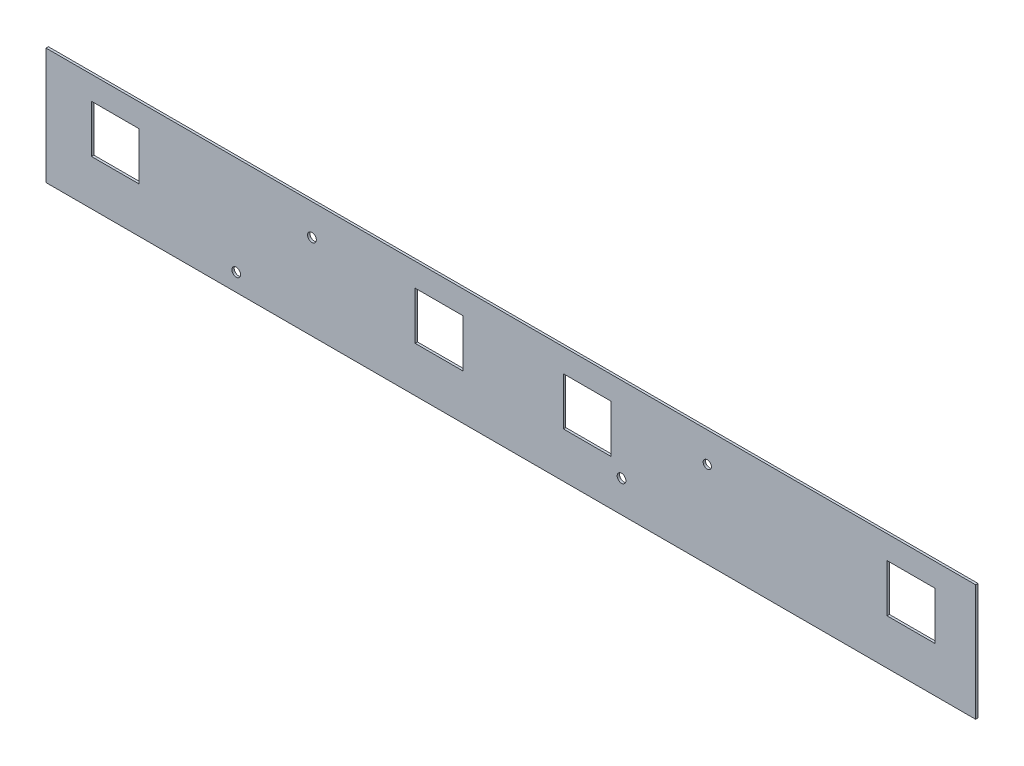
ISO-10303-21;
HEADER;
FILE_DESCRIPTION(('STEP AP214'),'2;1');
FILE_NAME('part.step','',(''),(''),'','','');
FILE_SCHEMA(('AUTOMOTIVE_DESIGN { 1 0 10303 214 1 1 1 1 }'));
ENDSEC;
DATA;
#1=APPLICATION_CONTEXT('core data for automotive mechanical design processes');
#2=APPLICATION_PROTOCOL_DEFINITION('international standard','automotive_design',2000,#1);
#3=PRODUCT_CONTEXT('',#1,'mechanical');
#4=PRODUCT('Part','Part','',(#3));
#5=PRODUCT_RELATED_PRODUCT_CATEGORY('part','',(#4));
#6=PRODUCT_DEFINITION_FORMATION('','',#4);
#7=PRODUCT_DEFINITION_CONTEXT('part definition',#1,'design');
#8=PRODUCT_DEFINITION('design','',#6,#7);
#9=PRODUCT_DEFINITION_SHAPE('','',#8);
#10=(LENGTH_UNIT() NAMED_UNIT(*) SI_UNIT(.MILLI.,.METRE.));
#11=(NAMED_UNIT(*) PLANE_ANGLE_UNIT() SI_UNIT($,.RADIAN.));
#12=(NAMED_UNIT(*) SI_UNIT($,.STERADIAN.) SOLID_ANGLE_UNIT());
#13=UNCERTAINTY_MEASURE_WITH_UNIT(LENGTH_MEASURE(1.E-05),#10,'distance_accuracy_value','');
#14=(GEOMETRIC_REPRESENTATION_CONTEXT(3) GLOBAL_UNCERTAINTY_ASSIGNED_CONTEXT((#13)) GLOBAL_UNIT_ASSIGNED_CONTEXT((#10,
#11,#12)) REPRESENTATION_CONTEXT('',''));
#15=CARTESIAN_POINT('',(0.,0.,0.));
#16=DIRECTION('',(0.,0.,1.));
#17=DIRECTION('',(1.,0.,0.));
#18=AXIS2_PLACEMENT_3D('',#15,#16,#17);
#19=CARTESIAN_POINT('',(-350.636981865229,-168.419363817683,-1.5875));
#20=DIRECTION('',(-1.,0.,0.));
#21=DIRECTION('',(0.,0.,1.));
#22=AXIS2_PLACEMENT_3D('',#19,#20,#21);
#23=PLANE('',#22);
#24=DIRECTION('',(0.,-1.,0.));
#25=VECTOR('',#24,1.);
#26=CARTESIAN_POINT('',(-350.636981865229,-168.419363817683,0.));
#27=LINE('',#26,#25);
#28=CARTESIAN_POINT('',(-350.636981865229,-90.2559438176829,0.));
#29=VERTEX_POINT('',#28);
#30=CARTESIAN_POINT('',(-350.636981865229,-168.419363817683,0.));
#31=VERTEX_POINT('',#30);
#32=EDGE_CURVE('E331',#29,#31,#27,.T.);
#33=ORIENTED_EDGE('',*,*,#32,.F.);
#34=DIRECTION('',(0.,0.,1.));
#35=VECTOR('',#34,1.);
#36=CARTESIAN_POINT('',(-350.636981865229,-90.2559438176829,-1.5875));
#37=LINE('',#36,#35);
#38=CARTESIAN_POINT('',(-350.636981865229,-90.2559438176829,-1.5875));
#39=VERTEX_POINT('',#38);
#40=EDGE_CURVE('E11',#39,#29,#37,.T.);
#41=ORIENTED_EDGE('',*,*,#40,.F.);
#42=DIRECTION('',(0.,-1.,0.));
#43=VECTOR('',#42,1.);
#44=CARTESIAN_POINT('',(-350.636981865229,-168.419363817683,-1.5875));
#45=LINE('',#44,#43);
#46=CARTESIAN_POINT('',(-350.636981865229,-168.419363817683,-1.5875));
#47=VERTEX_POINT('',#46);
#48=EDGE_CURVE('E334',#39,#47,#45,.T.);
#49=ORIENTED_EDGE('',*,*,#48,.T.);
#50=DIRECTION('',(0.,0.,1.));
#51=VECTOR('',#50,1.);
#52=CARTESIAN_POINT('',(-350.636981865229,-168.419363817683,-1.5875));
#53=LINE('',#52,#51);
#54=EDGE_CURVE('E41',#47,#31,#53,.T.);
#55=ORIENTED_EDGE('',*,*,#54,.T.);
#56=EDGE_LOOP('',(#33,#41,#49,#55));
#57=FACE_BOUND('',#56,.T.);
#58=ADVANCED_FACE('F38',(#57),#23,.T.);
#59=CARTESIAN_POINT('',(-350.636981865229,-90.2559438176829,-1.5875));
#60=DIRECTION('',(0.,1.,0.));
#61=DIRECTION('',(0.,0.,1.));
#62=AXIS2_PLACEMENT_3D('',#59,#60,#61);
#63=PLANE('',#62);
#64=DIRECTION('',(-1.,0.,0.));
#65=VECTOR('',#64,1.);
#66=CARTESIAN_POINT('',(-350.636981865229,-90.2559438176829,0.));
#67=LINE('',#66,#65);
#68=CARTESIAN_POINT('',(272.922858134777,-90.2559438176829,0.));
#69=VERTEX_POINT('',#68);
#70=EDGE_CURVE('E338',#69,#29,#67,.T.);
#71=ORIENTED_EDGE('',*,*,#70,.F.);
#72=DIRECTION('',(0.,0.,1.));
#73=VECTOR('',#72,1.);
#74=CARTESIAN_POINT('',(272.922858134777,-90.2559438176829,-1.5875));
#75=LINE('',#74,#73);
#76=CARTESIAN_POINT('',(272.922858134777,-90.2559438176829,-1.5875));
#77=VERTEX_POINT('',#76);
#78=EDGE_CURVE('E46',#77,#69,#75,.T.);
#79=ORIENTED_EDGE('',*,*,#78,.F.);
#80=DIRECTION('',(-1.,0.,0.));
#81=VECTOR('',#80,1.);
#82=CARTESIAN_POINT('',(-350.636981865229,-90.2559438176829,-1.5875));
#83=LINE('',#82,#81);
#84=EDGE_CURVE('E344',#77,#39,#83,.T.);
#85=ORIENTED_EDGE('',*,*,#84,.T.);
#86=ORIENTED_EDGE('',*,*,#40,.T.);
#87=EDGE_LOOP('',(#71,#79,#85,#86));
#88=FACE_BOUND('',#87,.T.);
#89=ADVANCED_FACE('F370',(#88),#63,.T.);
#90=CARTESIAN_POINT('',(272.922858134777,-168.419363817683,-1.5875));
#91=DIRECTION('',(1.,0.,0.));
#92=DIRECTION('',(0.,0.,-1.));
#93=AXIS2_PLACEMENT_3D('',#90,#91,#92);
#94=PLANE('',#93);
#95=DIRECTION('',(0.,1.,0.));
#96=VECTOR('',#95,1.);
#97=CARTESIAN_POINT('',(272.922858134777,-168.419363817683,0.));
#98=LINE('',#97,#96);
#99=CARTESIAN_POINT('',(272.922858134777,-168.419363817683,0.));
#100=VERTEX_POINT('',#99);
#101=EDGE_CURVE('E352',#100,#69,#98,.T.);
#102=ORIENTED_EDGE('',*,*,#101,.F.);
#103=DIRECTION('',(0.,0.,1.));
#104=VECTOR('',#103,1.);
#105=CARTESIAN_POINT('',(272.922858134777,-168.419363817683,-1.5875));
#106=LINE('',#105,#104);
#107=CARTESIAN_POINT('',(272.922858134777,-168.419363817683,-1.5875));
#108=VERTEX_POINT('',#107);
#109=EDGE_CURVE('E357',#108,#100,#106,.T.);
#110=ORIENTED_EDGE('',*,*,#109,.F.);
#111=DIRECTION('',(0.,1.,0.));
#112=VECTOR('',#111,1.);
#113=CARTESIAN_POINT('',(272.922858134777,-168.419363817683,-1.5875));
#114=LINE('',#113,#112);
#115=EDGE_CURVE('E341',#108,#77,#114,.T.);
#116=ORIENTED_EDGE('',*,*,#115,.T.);
#117=ORIENTED_EDGE('',*,*,#78,.T.);
#118=EDGE_LOOP('',(#102,#110,#116,#117));
#119=FACE_BOUND('',#118,.T.);
#120=ADVANCED_FACE('F375',(#119),#94,.T.);
#121=CARTESIAN_POINT('',(-350.636981865229,-168.419363817683,-1.5875));
#122=DIRECTION('',(0.,-1.,0.));
#123=DIRECTION('',(0.,0.,-1.));
#124=AXIS2_PLACEMENT_3D('',#121,#122,#123);
#125=PLANE('',#124);
#126=DIRECTION('',(1.,0.,0.));
#127=VECTOR('',#126,1.);
#128=CARTESIAN_POINT('',(-350.636981865229,-168.419363817683,0.));
#129=LINE('',#128,#127);
#130=EDGE_CURVE('E349',#31,#100,#129,.T.);
#131=ORIENTED_EDGE('',*,*,#130,.F.);
#132=ORIENTED_EDGE('',*,*,#54,.F.);
#133=DIRECTION('',(1.,0.,0.));
#134=VECTOR('',#133,1.);
#135=CARTESIAN_POINT('',(-350.636981865229,-168.419363817683,-1.5875));
#136=LINE('',#135,#134);
#137=EDGE_CURVE('E337',#47,#108,#136,.T.);
#138=ORIENTED_EDGE('',*,*,#137,.T.);
#139=ORIENTED_EDGE('',*,*,#109,.T.);
#140=EDGE_LOOP('',(#131,#132,#138,#139));
#141=FACE_BOUND('',#140,.T.);
#142=ADVANCED_FACE('F365',(#141),#125,.T.);
#143=CARTESIAN_POINT('',(0.,0.,-1.5875));
#144=DIRECTION('',(0.,0.,-1.));
#145=DIRECTION('',(-1.,0.,0.));
#146=AXIS2_PLACEMENT_3D('',#143,#144,#145);
#147=PLANE('',#146);
#148=CARTESIAN_POINT('',(35.3919470457483,-147.147547141894,-1.5875));
#149=DIRECTION('',(0.,0.,1.));
#150=DIRECTION('',(1.,0.,0.));
#151=AXIS2_PLACEMENT_3D('',#148,#149,#150);
#152=CIRCLE('',#151,2.921);
#153=CARTESIAN_POINT('',(38.3129470457483,-147.147547141894,-1.5875));
#154=VERTEX_POINT('',#153);
#155=EDGE_CURVE('E280',#154,#154,#152,.T.);
#156=ORIENTED_EDGE('',*,*,#155,.T.);
#157=EDGE_LOOP('',(#156));
#158=FACE_BOUND('',#157,.T.);
#159=CARTESIAN_POINT('',(-172.247688201685,-111.060995592852,-1.5875));
#160=DIRECTION('',(0.,0.,1.));
#161=DIRECTION('',(1.,0.,0.));
#162=AXIS2_PLACEMENT_3D('',#159,#160,#161);
#163=CIRCLE('',#162,2.92100000000005);
#164=CARTESIAN_POINT('',(-169.326688201685,-111.060995592852,-1.5875));
#165=VERTEX_POINT('',#164);
#166=EDGE_CURVE('E287',#165,#165,#163,.T.);
#167=ORIENTED_EDGE('',*,*,#166,.T.);
#168=EDGE_LOOP('',(#167));
#169=FACE_BOUND('',#168,.T.);
#170=CARTESIAN_POINT('',(-223.059163384461,-156.664689793981,-1.5875));
#171=DIRECTION('',(0.,0.,1.));
#172=DIRECTION('',(1.,0.,0.));
#173=AXIS2_PLACEMENT_3D('',#170,#171,#172);
#174=CIRCLE('',#173,2.921);
#175=CARTESIAN_POINT('',(-220.138163384461,-156.664689793981,-1.5875));
#176=VERTEX_POINT('',#175);
#177=EDGE_CURVE('E293',#176,#176,#174,.T.);
#178=ORIENTED_EDGE('',*,*,#177,.T.);
#179=EDGE_LOOP('',(#178));
#180=FACE_BOUND('',#179,.T.);
#181=DIRECTION('',(0.,-1.,0.));
#182=VECTOR('',#181,1.);
#183=CARTESIAN_POINT('',(-320.189901865221,-137.992427931692,-1.5875));
#184=LINE('',#183,#182);
#185=CARTESIAN_POINT('',(-320.189901865221,-105.912427931693,-1.5875));
#186=VERTEX_POINT('',#185);
#187=CARTESIAN_POINT('',(-320.189901865221,-137.992427931692,-1.5875));
#188=VERTEX_POINT('',#187);
#189=EDGE_CURVE('E300',#186,#188,#184,.T.);
#190=ORIENTED_EDGE('',*,*,#189,.T.);
#191=DIRECTION('',(1.,0.,0.));
#192=VECTOR('',#191,1.);
#193=CARTESIAN_POINT('',(-320.189901865221,-137.992427931692,-1.5875));
#194=LINE('',#193,#192);
#195=CARTESIAN_POINT('',(-288.109901865222,-137.992427931692,-1.5875));
#196=VERTEX_POINT('',#195);
#197=EDGE_CURVE('E303',#188,#196,#194,.T.);
#198=ORIENTED_EDGE('',*,*,#197,.T.);
#199=DIRECTION('',(0.,1.,0.));
#200=VECTOR('',#199,1.);
#201=CARTESIAN_POINT('',(-288.109901865222,-137.992427931692,-1.5875));
#202=LINE('',#201,#200);
#203=CARTESIAN_POINT('',(-288.109901865222,-105.912427931693,-1.5875));
#204=VERTEX_POINT('',#203);
#205=EDGE_CURVE('E54',#196,#204,#202,.T.);
#206=ORIENTED_EDGE('',*,*,#205,.T.);
#207=DIRECTION('',(-1.,0.,0.));
#208=VECTOR('',#207,1.);
#209=CARTESIAN_POINT('',(-320.189901865221,-105.912427931693,-1.5875));
#210=LINE('',#209,#208);
#211=EDGE_CURVE('E308',#204,#186,#210,.T.);
#212=ORIENTED_EDGE('',*,*,#211,.T.);
#213=EDGE_LOOP('',(#190,#198,#206,#212));
#214=FACE_BOUND('',#213,.T.);
#215=DIRECTION('',(0.,-1.,0.));
#216=VECTOR('',#215,1.);
#217=CARTESIAN_POINT('',(-102.971641865221,-137.99242793169,-1.5875));
#218=LINE('',#217,#216);
#219=CARTESIAN_POINT('',(-102.971641865221,-105.912427931692,-1.5875));
#220=VERTEX_POINT('',#219);
#221=CARTESIAN_POINT('',(-102.971641865221,-137.99242793169,-1.5875));
#222=VERTEX_POINT('',#221);
#223=EDGE_CURVE('E179',#220,#222,#218,.T.);
#224=ORIENTED_EDGE('',*,*,#223,.T.);
#225=DIRECTION('',(1.,0.,0.));
#226=VECTOR('',#225,1.);
#227=CARTESIAN_POINT('',(-102.971641865221,-137.99242793169,-1.5875));
#228=LINE('',#227,#226);
#229=CARTESIAN_POINT('',(-70.8916418652224,-137.99242793169,-1.5875));
#230=VERTEX_POINT('',#229);
#231=EDGE_CURVE('E190',#222,#230,#228,.T.);
#232=ORIENTED_EDGE('',*,*,#231,.T.);
#233=DIRECTION('',(0.,1.,0.));
#234=VECTOR('',#233,1.);
#235=CARTESIAN_POINT('',(-70.8916418652224,-137.99242793169,-1.5875));
#236=LINE('',#235,#234);
#237=CARTESIAN_POINT('',(-70.8916418652224,-105.912427931692,-1.5875));
#238=VERTEX_POINT('',#237);
#239=EDGE_CURVE('E62',#230,#238,#236,.T.);
#240=ORIENTED_EDGE('',*,*,#239,.T.);
#241=DIRECTION('',(-1.,0.,0.));
#242=VECTOR('',#241,1.);
#243=CARTESIAN_POINT('',(-102.971641865221,-105.912427931692,-1.5875));
#244=LINE('',#243,#242);
#245=EDGE_CURVE('E187',#238,#220,#244,.T.);
#246=ORIENTED_EDGE('',*,*,#245,.T.);
#247=EDGE_LOOP('',(#224,#232,#240,#246));
#248=FACE_BOUND('',#247,.T.);
#249=DIRECTION('',(0.,-1.,0.));
#250=VECTOR('',#249,1.);
#251=CARTESIAN_POINT('',(-3.64748186522514,-137.99242793169,-1.5875));
#252=LINE('',#251,#250);
#253=CARTESIAN_POINT('',(-3.64748186522514,-105.912427931693,-1.5875));
#254=VERTEX_POINT('',#253);
#255=CARTESIAN_POINT('',(-3.64748186522514,-137.99242793169,-1.5875));
#256=VERTEX_POINT('',#255);
#257=EDGE_CURVE('E217',#254,#256,#252,.T.);
#258=ORIENTED_EDGE('',*,*,#257,.T.);
#259=DIRECTION('',(1.,0.,0.));
#260=VECTOR('',#259,1.);
#261=CARTESIAN_POINT('',(-3.64748186522514,-137.99242793169,-1.5875));
#262=LINE('',#261,#260);
#263=CARTESIAN_POINT('',(28.4325181347717,-137.99242793169,-1.5875));
#264=VERTEX_POINT('',#263);
#265=EDGE_CURVE('E220',#256,#264,#262,.T.);
#266=ORIENTED_EDGE('',*,*,#265,.T.);
#267=DIRECTION('',(0.,1.,0.));
#268=VECTOR('',#267,1.);
#269=CARTESIAN_POINT('',(28.4325181347717,-137.99242793169,-1.5875));
#270=LINE('',#269,#268);
#271=CARTESIAN_POINT('',(28.4325181347717,-105.912427931693,-1.5875));
#272=VERTEX_POINT('',#271);
#273=EDGE_CURVE('E224',#264,#272,#270,.T.);
#274=ORIENTED_EDGE('',*,*,#273,.T.);
#275=DIRECTION('',(-1.,0.,0.));
#276=VECTOR('',#275,1.);
#277=CARTESIAN_POINT('',(-3.64748186522514,-105.912427931693,-1.5875));
#278=LINE('',#277,#276);
#279=EDGE_CURVE('E227',#272,#254,#278,.T.);
#280=ORIENTED_EDGE('',*,*,#279,.T.);
#281=EDGE_LOOP('',(#258,#266,#274,#280));
#282=FACE_BOUND('',#281,.T.);
#283=DIRECTION('',(0.,-1.,0.));
#284=VECTOR('',#283,1.);
#285=CARTESIAN_POINT('',(213.570778134775,-137.992427931688,-1.5875));
#286=LINE('',#285,#284);
#287=CARTESIAN_POINT('',(213.570778134775,-105.912427931693,-1.5875));
#288=VERTEX_POINT('',#287);
#289=CARTESIAN_POINT('',(213.570778134775,-137.992427931688,-1.5875));
#290=VERTEX_POINT('',#289);
#291=EDGE_CURVE('E249',#288,#290,#286,.T.);
#292=ORIENTED_EDGE('',*,*,#291,.T.);
#293=DIRECTION('',(1.,0.,0.));
#294=VECTOR('',#293,1.);
#295=CARTESIAN_POINT('',(213.570778134775,-137.992427931688,-1.5875));
#296=LINE('',#295,#294);
#297=CARTESIAN_POINT('',(245.65077813477,-137.992427931688,-1.5875));
#298=VERTEX_POINT('',#297);
#299=EDGE_CURVE('E252',#290,#298,#296,.T.);
#300=ORIENTED_EDGE('',*,*,#299,.T.);
#301=DIRECTION('',(0.,1.,0.));
#302=VECTOR('',#301,1.);
#303=CARTESIAN_POINT('',(245.65077813477,-137.992427931688,-1.5875));
#304=LINE('',#303,#302);
#305=CARTESIAN_POINT('',(245.65077813477,-105.912427931693,-1.5875));
#306=VERTEX_POINT('',#305);
#307=EDGE_CURVE('E256',#298,#306,#304,.T.);
#308=ORIENTED_EDGE('',*,*,#307,.T.);
#309=DIRECTION('',(-1.,0.,0.));
#310=VECTOR('',#309,1.);
#311=CARTESIAN_POINT('',(213.570778134775,-105.912427931693,-1.5875));
#312=LINE('',#311,#310);
#313=EDGE_CURVE('E259',#306,#288,#312,.T.);
#314=ORIENTED_EDGE('',*,*,#313,.T.);
#315=EDGE_LOOP('',(#292,#300,#308,#314));
#316=FACE_BOUND('',#315,.T.);
#317=CARTESIAN_POINT('',(92.9145155292168,-110.36906090191,-1.5875));
#318=DIRECTION('',(0.,0.,1.));
#319=DIRECTION('',(1.,0.,0.));
#320=AXIS2_PLACEMENT_3D('',#317,#318,#319);
#321=CIRCLE('',#320,2.75000000000002);
#322=CARTESIAN_POINT('',(95.6645155292168,-110.36906090191,-1.5875));
#323=VERTEX_POINT('',#322);
#324=EDGE_CURVE('E328',#323,#323,#321,.T.);
#325=ORIENTED_EDGE('',*,*,#324,.T.);
#326=EDGE_LOOP('',(#325));
#327=FACE_BOUND('',#326,.T.);
#328=ORIENTED_EDGE('',*,*,#48,.F.);
#329=ORIENTED_EDGE('',*,*,#84,.F.);
#330=ORIENTED_EDGE('',*,*,#115,.F.);
#331=ORIENTED_EDGE('',*,*,#137,.F.);
#332=EDGE_LOOP('',(#328,#329,#330,#331));
#333=FACE_BOUND('',#332,.T.);
#334=ADVANCED_FACE('F194',(#158,#169,#180,#214,#248,#282,#316,#327,#333),#147,.T.);
#335=CARTESIAN_POINT('',(0.,0.,0.));
#336=DIRECTION('',(0.,0.,-1.));
#337=DIRECTION('',(-1.,0.,0.));
#338=AXIS2_PLACEMENT_3D('',#335,#336,#337);
#339=PLANE('',#338);
#340=CARTESIAN_POINT('',(35.3919470457483,-147.147547141894,0.));
#341=DIRECTION('',(0.,0.,1.));
#342=DIRECTION('',(1.,0.,0.));
#343=AXIS2_PLACEMENT_3D('',#340,#341,#342);
#344=CIRCLE('',#343,2.921);
#345=CARTESIAN_POINT('',(38.3129470457483,-147.147547141894,0.));
#346=VERTEX_POINT('',#345);
#347=EDGE_CURVE('E284',#346,#346,#344,.T.);
#348=ORIENTED_EDGE('',*,*,#347,.F.);
#349=EDGE_LOOP('',(#348));
#350=FACE_BOUND('',#349,.T.);
#351=CARTESIAN_POINT('',(-172.247688201685,-111.060995592852,0.));
#352=DIRECTION('',(0.,0.,1.));
#353=DIRECTION('',(1.,0.,0.));
#354=AXIS2_PLACEMENT_3D('',#351,#352,#353);
#355=CIRCLE('',#354,2.92100000000005);
#356=CARTESIAN_POINT('',(-169.326688201685,-111.060995592852,0.));
#357=VERTEX_POINT('',#356);
#358=EDGE_CURVE('E290',#357,#357,#355,.T.);
#359=ORIENTED_EDGE('',*,*,#358,.F.);
#360=EDGE_LOOP('',(#359));
#361=FACE_BOUND('',#360,.T.);
#362=CARTESIAN_POINT('',(-223.059163384461,-156.664689793981,0.));
#363=DIRECTION('',(0.,0.,1.));
#364=DIRECTION('',(1.,0.,0.));
#365=AXIS2_PLACEMENT_3D('',#362,#363,#364);
#366=CIRCLE('',#365,2.921);
#367=CARTESIAN_POINT('',(-220.138163384461,-156.664689793981,0.));
#368=VERTEX_POINT('',#367);
#369=EDGE_CURVE('E296',#368,#368,#366,.T.);
#370=ORIENTED_EDGE('',*,*,#369,.F.);
#371=EDGE_LOOP('',(#370));
#372=FACE_BOUND('',#371,.T.);
#373=DIRECTION('',(1.,0.,0.));
#374=VECTOR('',#373,1.);
#375=CARTESIAN_POINT('',(-320.189901865221,-137.992427931692,0.));
#376=LINE('',#375,#374);
#377=CARTESIAN_POINT('',(-320.189901865221,-137.992427931692,0.));
#378=VERTEX_POINT('',#377);
#379=CARTESIAN_POINT('',(-288.109901865222,-137.992427931692,0.));
#380=VERTEX_POINT('',#379);
#381=EDGE_CURVE('E313',#378,#380,#376,.T.);
#382=ORIENTED_EDGE('',*,*,#381,.F.);
#383=DIRECTION('',(0.,-1.,0.));
#384=VECTOR('',#383,1.);
#385=CARTESIAN_POINT('',(-320.189901865221,-137.992427931692,0.));
#386=LINE('',#385,#384);
#387=CARTESIAN_POINT('',(-320.189901865221,-105.912427931693,0.));
#388=VERTEX_POINT('',#387);
#389=EDGE_CURVE('E213',#388,#378,#386,.T.);
#390=ORIENTED_EDGE('',*,*,#389,.F.);
#391=DIRECTION('',(-1.,0.,0.));
#392=VECTOR('',#391,1.);
#393=CARTESIAN_POINT('',(-320.189901865221,-105.912427931693,0.));
#394=LINE('',#393,#392);
#395=CARTESIAN_POINT('',(-288.109901865222,-105.912427931693,0.));
#396=VERTEX_POINT('',#395);
#397=EDGE_CURVE('E304',#396,#388,#394,.T.);
#398=ORIENTED_EDGE('',*,*,#397,.F.);
#399=DIRECTION('',(0.,1.,0.));
#400=VECTOR('',#399,1.);
#401=CARTESIAN_POINT('',(-288.109901865222,-137.992427931692,0.));
#402=LINE('',#401,#400);
#403=EDGE_CURVE('E316',#380,#396,#402,.T.);
#404=ORIENTED_EDGE('',*,*,#403,.F.);
#405=EDGE_LOOP('',(#382,#390,#398,#404));
#406=FACE_BOUND('',#405,.T.);
#407=DIRECTION('',(1.,0.,0.));
#408=VECTOR('',#407,1.);
#409=CARTESIAN_POINT('',(-102.971641865221,-137.99242793169,0.));
#410=LINE('',#409,#408);
#411=CARTESIAN_POINT('',(-102.971641865221,-137.99242793169,0.));
#412=VERTEX_POINT('',#411);
#413=CARTESIAN_POINT('',(-70.8916418652224,-137.99242793169,0.));
#414=VERTEX_POINT('',#413);
#415=EDGE_CURVE('E206',#412,#414,#410,.T.);
#416=ORIENTED_EDGE('',*,*,#415,.F.);
#417=DIRECTION('',(0.,-1.,0.));
#418=VECTOR('',#417,1.);
#419=CARTESIAN_POINT('',(-102.971641865221,-137.99242793169,0.));
#420=LINE('',#419,#418);
#421=CARTESIAN_POINT('',(-102.971641865221,-105.912427931692,0.));
#422=VERTEX_POINT('',#421);
#423=EDGE_CURVE('E182',#422,#412,#420,.T.);
#424=ORIENTED_EDGE('',*,*,#423,.F.);
#425=DIRECTION('',(-1.,0.,0.));
#426=VECTOR('',#425,1.);
#427=CARTESIAN_POINT('',(-102.971641865221,-105.912427931692,0.));
#428=LINE('',#427,#426);
#429=CARTESIAN_POINT('',(-70.8916418652224,-105.912427931692,0.));
#430=VERTEX_POINT('',#429);
#431=EDGE_CURVE('E197',#430,#422,#428,.T.);
#432=ORIENTED_EDGE('',*,*,#431,.F.);
#433=DIRECTION('',(0.,1.,0.));
#434=VECTOR('',#433,1.);
#435=CARTESIAN_POINT('',(-70.8916418652224,-137.99242793169,0.));
#436=LINE('',#435,#434);
#437=EDGE_CURVE('E200',#414,#430,#436,.T.);
#438=ORIENTED_EDGE('',*,*,#437,.F.);
#439=EDGE_LOOP('',(#416,#424,#432,#438));
#440=FACE_BOUND('',#439,.T.);
#441=DIRECTION('',(1.,0.,0.));
#442=VECTOR('',#441,1.);
#443=CARTESIAN_POINT('',(-3.64748186522514,-137.99242793169,0.));
#444=LINE('',#443,#442);
#445=CARTESIAN_POINT('',(-3.64748186522514,-137.99242793169,0.));
#446=VERTEX_POINT('',#445);
#447=CARTESIAN_POINT('',(28.4325181347717,-137.99242793169,0.));
#448=VERTEX_POINT('',#447);
#449=EDGE_CURVE('E233',#446,#448,#444,.T.);
#450=ORIENTED_EDGE('',*,*,#449,.F.);
#451=DIRECTION('',(0.,-1.,0.));
#452=VECTOR('',#451,1.);
#453=CARTESIAN_POINT('',(-3.64748186522514,-137.99242793169,0.));
#454=LINE('',#453,#452);
#455=CARTESIAN_POINT('',(-3.64748186522514,-105.912427931693,0.));
#456=VERTEX_POINT('',#455);
#457=EDGE_CURVE('E231',#456,#446,#454,.T.);
#458=ORIENTED_EDGE('',*,*,#457,.F.);
#459=DIRECTION('',(-1.,0.,0.));
#460=VECTOR('',#459,1.);
#461=CARTESIAN_POINT('',(-3.64748186522514,-105.912427931693,0.));
#462=LINE('',#461,#460);
#463=CARTESIAN_POINT('',(28.4325181347717,-105.912427931693,0.));
#464=VERTEX_POINT('',#463);
#465=EDGE_CURVE('E221',#464,#456,#462,.T.);
#466=ORIENTED_EDGE('',*,*,#465,.F.);
#467=DIRECTION('',(0.,1.,0.));
#468=VECTOR('',#467,1.);
#469=CARTESIAN_POINT('',(28.4325181347717,-137.99242793169,0.));
#470=LINE('',#469,#468);
#471=EDGE_CURVE('E237',#448,#464,#470,.T.);
#472=ORIENTED_EDGE('',*,*,#471,.F.);
#473=EDGE_LOOP('',(#450,#458,#466,#472));
#474=FACE_BOUND('',#473,.T.);
#475=DIRECTION('',(1.,0.,0.));
#476=VECTOR('',#475,1.);
#477=CARTESIAN_POINT('',(213.570778134775,-137.992427931688,0.));
#478=LINE('',#477,#476);
#479=CARTESIAN_POINT('',(213.570778134775,-137.992427931688,0.));
#480=VERTEX_POINT('',#479);
#481=CARTESIAN_POINT('',(245.65077813477,-137.992427931688,0.));
#482=VERTEX_POINT('',#481);
#483=EDGE_CURVE('E265',#480,#482,#478,.T.);
#484=ORIENTED_EDGE('',*,*,#483,.F.);
#485=DIRECTION('',(0.,-1.,0.));
#486=VECTOR('',#485,1.);
#487=CARTESIAN_POINT('',(213.570778134775,-137.992427931688,0.));
#488=LINE('',#487,#486);
#489=CARTESIAN_POINT('',(213.570778134775,-105.912427931693,0.));
#490=VERTEX_POINT('',#489);
#491=EDGE_CURVE('E263',#490,#480,#488,.T.);
#492=ORIENTED_EDGE('',*,*,#491,.F.);
#493=DIRECTION('',(-1.,0.,0.));
#494=VECTOR('',#493,1.);
#495=CARTESIAN_POINT('',(213.570778134775,-105.912427931693,0.));
#496=LINE('',#495,#494);
#497=CARTESIAN_POINT('',(245.65077813477,-105.912427931693,0.));
#498=VERTEX_POINT('',#497);
#499=EDGE_CURVE('E253',#498,#490,#496,.T.);
#500=ORIENTED_EDGE('',*,*,#499,.F.);
#501=DIRECTION('',(0.,1.,0.));
#502=VECTOR('',#501,1.);
#503=CARTESIAN_POINT('',(245.65077813477,-137.992427931688,0.));
#504=LINE('',#503,#502);
#505=EDGE_CURVE('E268',#482,#498,#504,.T.);
#506=ORIENTED_EDGE('',*,*,#505,.F.);
#507=EDGE_LOOP('',(#484,#492,#500,#506));
#508=FACE_BOUND('',#507,.T.);
#509=CARTESIAN_POINT('',(92.9145155292168,-110.36906090191,0.));
#510=DIRECTION('',(0.,0.,1.));
#511=DIRECTION('',(1.,0.,0.));
#512=AXIS2_PLACEMENT_3D('',#509,#510,#511);
#513=CIRCLE('',#512,2.75000000000002);
#514=CARTESIAN_POINT('',(95.6645155292168,-110.36906090191,0.));
#515=VERTEX_POINT('',#514);
#516=EDGE_CURVE('E283',#515,#515,#513,.T.);
#517=ORIENTED_EDGE('',*,*,#516,.F.);
#518=EDGE_LOOP('',(#517));
#519=FACE_BOUND('',#518,.T.);
#520=ORIENTED_EDGE('',*,*,#32,.T.);
#521=ORIENTED_EDGE('',*,*,#130,.T.);
#522=ORIENTED_EDGE('',*,*,#101,.T.);
#523=ORIENTED_EDGE('',*,*,#70,.T.);
#524=EDGE_LOOP('',(#520,#521,#522,#523));
#525=FACE_BOUND('',#524,.T.);
#526=ADVANCED_FACE('F367',(#350,#361,#372,#406,#440,#474,#508,#519,#525),#339,.F.);
#527=CARTESIAN_POINT('',(92.9145155292168,-110.36906090191,-1.5875));
#528=DIRECTION('',(0.,0.,1.));
#529=DIRECTION('',(1.,0.,0.));
#530=AXIS2_PLACEMENT_3D('',#527,#528,#529);
#531=CYLINDRICAL_SURFACE('',#530,2.75000000000002);
#532=ORIENTED_EDGE('',*,*,#324,.F.);
#533=EDGE_LOOP('',(#532));
#534=FACE_BOUND('',#533,.T.);
#535=ORIENTED_EDGE('',*,*,#516,.T.);
#536=EDGE_LOOP('',(#535));
#537=FACE_BOUND('',#536,.T.);
#538=ADVANCED_FACE('F422',(#534,#537),#531,.F.);
#539=CARTESIAN_POINT('',(213.570778134775,-137.992427931688,-1.5875));
#540=DIRECTION('',(-1.,0.,0.));
#541=DIRECTION('',(0.,0.,1.));
#542=AXIS2_PLACEMENT_3D('',#539,#540,#541);
#543=PLANE('',#542);
#544=ORIENTED_EDGE('',*,*,#491,.T.);
#545=DIRECTION('',(0.,0.,1.));
#546=VECTOR('',#545,1.);
#547=CARTESIAN_POINT('',(213.570778134775,-137.992427931688,-1.5875));
#548=LINE('',#547,#546);
#549=EDGE_CURVE('E262',#290,#480,#548,.T.);
#550=ORIENTED_EDGE('',*,*,#549,.F.);
#551=ORIENTED_EDGE('',*,*,#291,.F.);
#552=DIRECTION('',(0.,0.,1.));
#553=VECTOR('',#552,1.);
#554=CARTESIAN_POINT('',(213.570778134775,-105.912427931693,-1.5875));
#555=LINE('',#554,#553);
#556=EDGE_CURVE('E234',#288,#490,#555,.T.);
#557=ORIENTED_EDGE('',*,*,#556,.T.);
#558=EDGE_LOOP('',(#544,#550,#551,#557));
#559=FACE_BOUND('',#558,.T.);
#560=ADVANCED_FACE('F433',(#559),#543,.F.);
#561=CARTESIAN_POINT('',(213.570778134775,-105.912427931693,-1.5875));
#562=DIRECTION('',(0.,1.,0.));
#563=DIRECTION('',(0.,0.,1.));
#564=AXIS2_PLACEMENT_3D('',#561,#562,#563);
#565=PLANE('',#564);
#566=ORIENTED_EDGE('',*,*,#499,.T.);
#567=ORIENTED_EDGE('',*,*,#556,.F.);
#568=ORIENTED_EDGE('',*,*,#313,.F.);
#569=DIRECTION('',(0.,0.,1.));
#570=VECTOR('',#569,1.);
#571=CARTESIAN_POINT('',(245.65077813477,-105.912427931693,-1.5875));
#572=LINE('',#571,#570);
#573=EDGE_CURVE('E274',#306,#498,#572,.T.);
#574=ORIENTED_EDGE('',*,*,#573,.T.);
#575=EDGE_LOOP('',(#566,#567,#568,#574));
#576=FACE_BOUND('',#575,.T.);
#577=ADVANCED_FACE('F444',(#576),#565,.F.);
#578=CARTESIAN_POINT('',(245.65077813477,-137.992427931688,-1.5875));
#579=DIRECTION('',(1.,0.,0.));
#580=DIRECTION('',(0.,0.,-1.));
#581=AXIS2_PLACEMENT_3D('',#578,#579,#580);
#582=PLANE('',#581);
#583=ORIENTED_EDGE('',*,*,#505,.T.);
#584=ORIENTED_EDGE('',*,*,#573,.F.);
#585=ORIENTED_EDGE('',*,*,#307,.F.);
#586=DIRECTION('',(0.,0.,1.));
#587=VECTOR('',#586,1.);
#588=CARTESIAN_POINT('',(245.65077813477,-137.992427931688,-1.5875));
#589=LINE('',#588,#587);
#590=EDGE_CURVE('E276',#298,#482,#589,.T.);
#591=ORIENTED_EDGE('',*,*,#590,.T.);
#592=EDGE_LOOP('',(#583,#584,#585,#591));
#593=FACE_BOUND('',#592,.T.);
#594=ADVANCED_FACE('F455',(#593),#582,.F.);
#595=CARTESIAN_POINT('',(213.570778134775,-137.992427931688,-1.5875));
#596=DIRECTION('',(0.,-1.,0.));
#597=DIRECTION('',(0.,0.,-1.));
#598=AXIS2_PLACEMENT_3D('',#595,#596,#597);
#599=PLANE('',#598);
#600=ORIENTED_EDGE('',*,*,#483,.T.);
#601=ORIENTED_EDGE('',*,*,#590,.F.);
#602=ORIENTED_EDGE('',*,*,#299,.F.);
#603=ORIENTED_EDGE('',*,*,#549,.T.);
#604=EDGE_LOOP('',(#600,#601,#602,#603));
#605=FACE_BOUND('',#604,.T.);
#606=ADVANCED_FACE('F466',(#605),#599,.F.);
#607=CARTESIAN_POINT('',(-3.64748186522514,-137.99242793169,-1.5875));
#608=DIRECTION('',(-1.,0.,0.));
#609=DIRECTION('',(0.,0.,1.));
#610=AXIS2_PLACEMENT_3D('',#607,#608,#609);
#611=PLANE('',#610);
#612=ORIENTED_EDGE('',*,*,#457,.T.);
#613=DIRECTION('',(0.,0.,1.));
#614=VECTOR('',#613,1.);
#615=CARTESIAN_POINT('',(-3.64748186522514,-137.99242793169,-1.5875));
#616=LINE('',#615,#614);
#617=EDGE_CURVE('E230',#256,#446,#616,.T.);
#618=ORIENTED_EDGE('',*,*,#617,.F.);
#619=ORIENTED_EDGE('',*,*,#257,.F.);
#620=DIRECTION('',(0.,0.,1.));
#621=VECTOR('',#620,1.);
#622=CARTESIAN_POINT('',(-3.64748186522514,-105.912427931693,-1.5875));
#623=LINE('',#622,#621);
#624=EDGE_CURVE('E207',#254,#456,#623,.T.);
#625=ORIENTED_EDGE('',*,*,#624,.T.);
#626=EDGE_LOOP('',(#612,#618,#619,#625));
#627=FACE_BOUND('',#626,.T.);
#628=ADVANCED_FACE('F477',(#627),#611,.F.);
#629=CARTESIAN_POINT('',(-3.64748186522514,-105.912427931693,-1.5875));
#630=DIRECTION('',(0.,1.,0.));
#631=DIRECTION('',(0.,0.,1.));
#632=AXIS2_PLACEMENT_3D('',#629,#630,#631);
#633=PLANE('',#632);
#634=ORIENTED_EDGE('',*,*,#465,.T.);
#635=ORIENTED_EDGE('',*,*,#624,.F.);
#636=ORIENTED_EDGE('',*,*,#279,.F.);
#637=DIRECTION('',(0.,0.,1.));
#638=VECTOR('',#637,1.);
#639=CARTESIAN_POINT('',(28.4325181347717,-105.912427931693,-1.5875));
#640=LINE('',#639,#638);
#641=EDGE_CURVE('E243',#272,#464,#640,.T.);
#642=ORIENTED_EDGE('',*,*,#641,.T.);
#643=EDGE_LOOP('',(#634,#635,#636,#642));
#644=FACE_BOUND('',#643,.T.);
#645=ADVANCED_FACE('F488',(#644),#633,.F.);
#646=CARTESIAN_POINT('',(28.4325181347717,-137.99242793169,-1.5875));
#647=DIRECTION('',(1.,0.,0.));
#648=DIRECTION('',(0.,0.,-1.));
#649=AXIS2_PLACEMENT_3D('',#646,#647,#648);
#650=PLANE('',#649);
#651=ORIENTED_EDGE('',*,*,#471,.T.);
#652=ORIENTED_EDGE('',*,*,#641,.F.);
#653=ORIENTED_EDGE('',*,*,#273,.F.);
#654=DIRECTION('',(0.,0.,1.));
#655=VECTOR('',#654,1.);
#656=CARTESIAN_POINT('',(28.4325181347717,-137.99242793169,-1.5875));
#657=LINE('',#656,#655);
#658=EDGE_CURVE('E245',#264,#448,#657,.T.);
#659=ORIENTED_EDGE('',*,*,#658,.T.);
#660=EDGE_LOOP('',(#651,#652,#653,#659));
#661=FACE_BOUND('',#660,.T.);
#662=ADVANCED_FACE('F499',(#661),#650,.F.);
#663=CARTESIAN_POINT('',(-3.64748186522514,-137.99242793169,-1.5875));
#664=DIRECTION('',(0.,-1.,0.));
#665=DIRECTION('',(0.,0.,-1.));
#666=AXIS2_PLACEMENT_3D('',#663,#664,#665);
#667=PLANE('',#666);
#668=ORIENTED_EDGE('',*,*,#449,.T.);
#669=ORIENTED_EDGE('',*,*,#658,.F.);
#670=ORIENTED_EDGE('',*,*,#265,.F.);
#671=ORIENTED_EDGE('',*,*,#617,.T.);
#672=EDGE_LOOP('',(#668,#669,#670,#671));
#673=FACE_BOUND('',#672,.T.);
#674=ADVANCED_FACE('F510',(#673),#667,.F.);
#675=CARTESIAN_POINT('',(-102.971641865221,-137.99242793169,-1.5875));
#676=DIRECTION('',(-1.,0.,0.));
#677=DIRECTION('',(0.,0.,1.));
#678=AXIS2_PLACEMENT_3D('',#675,#676,#677);
#679=PLANE('',#678);
#680=ORIENTED_EDGE('',*,*,#423,.T.);
#681=DIRECTION('',(0.,0.,1.));
#682=VECTOR('',#681,1.);
#683=CARTESIAN_POINT('',(-102.971641865221,-137.99242793169,-1.5875));
#684=LINE('',#683,#682);
#685=EDGE_CURVE('E175',#222,#412,#684,.T.);
#686=ORIENTED_EDGE('',*,*,#685,.F.);
#687=ORIENTED_EDGE('',*,*,#223,.F.);
#688=DIRECTION('',(0.,0.,1.));
#689=VECTOR('',#688,1.);
#690=CARTESIAN_POINT('',(-102.971641865221,-105.912427931692,-1.5875));
#691=LINE('',#690,#689);
#692=EDGE_CURVE('E211',#220,#422,#691,.T.);
#693=ORIENTED_EDGE('',*,*,#692,.T.);
#694=EDGE_LOOP('',(#680,#686,#687,#693));
#695=FACE_BOUND('',#694,.T.);
#696=ADVANCED_FACE('F177',(#695),#679,.F.);
#697=CARTESIAN_POINT('',(-102.971641865221,-105.912427931692,-1.5875));
#698=DIRECTION('',(0.,1.,0.));
#699=DIRECTION('',(0.,0.,1.));
#700=AXIS2_PLACEMENT_3D('',#697,#698,#699);
#701=PLANE('',#700);
#702=ORIENTED_EDGE('',*,*,#431,.T.);
#703=ORIENTED_EDGE('',*,*,#692,.F.);
#704=ORIENTED_EDGE('',*,*,#245,.F.);
#705=DIRECTION('',(0.,0.,1.));
#706=VECTOR('',#705,1.);
#707=CARTESIAN_POINT('',(-70.8916418652224,-105.912427931692,-1.5875));
#708=LINE('',#707,#706);
#709=EDGE_CURVE('E214',#238,#430,#708,.T.);
#710=ORIENTED_EDGE('',*,*,#709,.T.);
#711=EDGE_LOOP('',(#702,#703,#704,#710));
#712=FACE_BOUND('',#711,.T.);
#713=ADVANCED_FACE('F531',(#712),#701,.F.);
#714=CARTESIAN_POINT('',(-70.8916418652224,-137.99242793169,-1.5875));
#715=DIRECTION('',(1.,0.,0.));
#716=DIRECTION('',(0.,0.,-1.));
#717=AXIS2_PLACEMENT_3D('',#714,#715,#716);
#718=PLANE('',#717);
#719=ORIENTED_EDGE('',*,*,#437,.T.);
#720=ORIENTED_EDGE('',*,*,#709,.F.);
#721=ORIENTED_EDGE('',*,*,#239,.F.);
#722=DIRECTION('',(0.,0.,1.));
#723=VECTOR('',#722,1.);
#724=CARTESIAN_POINT('',(-70.8916418652224,-137.99242793169,-1.5875));
#725=LINE('',#724,#723);
#726=EDGE_CURVE('E186',#230,#414,#725,.T.);
#727=ORIENTED_EDGE('',*,*,#726,.T.);
#728=EDGE_LOOP('',(#719,#720,#721,#727));
#729=FACE_BOUND('',#728,.T.);
#730=ADVANCED_FACE('F541',(#729),#718,.F.);
#731=CARTESIAN_POINT('',(-102.971641865221,-137.99242793169,-1.5875));
#732=DIRECTION('',(0.,-1.,0.));
#733=DIRECTION('',(0.,0.,-1.));
#734=AXIS2_PLACEMENT_3D('',#731,#732,#733);
#735=PLANE('',#734);
#736=ORIENTED_EDGE('',*,*,#415,.T.);
#737=ORIENTED_EDGE('',*,*,#726,.F.);
#738=ORIENTED_EDGE('',*,*,#231,.F.);
#739=ORIENTED_EDGE('',*,*,#685,.T.);
#740=EDGE_LOOP('',(#736,#737,#738,#739));
#741=FACE_BOUND('',#740,.T.);
#742=ADVANCED_FACE('F191',(#741),#735,.F.);
#743=CARTESIAN_POINT('',(-320.189901865221,-137.992427931692,-1.5875));
#744=DIRECTION('',(-1.,0.,0.));
#745=DIRECTION('',(0.,0.,1.));
#746=AXIS2_PLACEMENT_3D('',#743,#744,#745);
#747=PLANE('',#746);
#748=ORIENTED_EDGE('',*,*,#389,.T.);
#749=DIRECTION('',(0.,0.,1.));
#750=VECTOR('',#749,1.);
#751=CARTESIAN_POINT('',(-320.189901865221,-137.992427931692,-1.5875));
#752=LINE('',#751,#750);
#753=EDGE_CURVE('E311',#188,#378,#752,.T.);
#754=ORIENTED_EDGE('',*,*,#753,.F.);
#755=ORIENTED_EDGE('',*,*,#189,.F.);
#756=DIRECTION('',(0.,0.,1.));
#757=VECTOR('',#756,1.);
#758=CARTESIAN_POINT('',(-320.189901865221,-105.912427931693,-1.5875));
#759=LINE('',#758,#757);
#760=EDGE_CURVE('E299',#186,#388,#759,.T.);
#761=ORIENTED_EDGE('',*,*,#760,.T.);
#762=EDGE_LOOP('',(#748,#754,#755,#761));
#763=FACE_BOUND('',#762,.T.);
#764=ADVANCED_FACE('F561',(#763),#747,.F.);
#765=CARTESIAN_POINT('',(-320.189901865221,-105.912427931693,-1.5875));
#766=DIRECTION('',(0.,1.,0.));
#767=DIRECTION('',(0.,0.,1.));
#768=AXIS2_PLACEMENT_3D('',#765,#766,#767);
#769=PLANE('',#768);
#770=ORIENTED_EDGE('',*,*,#397,.T.);
#771=ORIENTED_EDGE('',*,*,#760,.F.);
#772=ORIENTED_EDGE('',*,*,#211,.F.);
#773=DIRECTION('',(0.,0.,1.));
#774=VECTOR('',#773,1.);
#775=CARTESIAN_POINT('',(-288.109901865222,-105.912427931693,-1.5875));
#776=LINE('',#775,#774);
#777=EDGE_CURVE('E322',#204,#396,#776,.T.);
#778=ORIENTED_EDGE('',*,*,#777,.T.);
#779=EDGE_LOOP('',(#770,#771,#772,#778));
#780=FACE_BOUND('',#779,.T.);
#781=ADVANCED_FACE('F571',(#780),#769,.F.);
#782=CARTESIAN_POINT('',(-288.109901865222,-137.992427931692,-1.5875));
#783=DIRECTION('',(1.,0.,0.));
#784=DIRECTION('',(0.,0.,-1.));
#785=AXIS2_PLACEMENT_3D('',#782,#783,#784);
#786=PLANE('',#785);
#787=ORIENTED_EDGE('',*,*,#403,.T.);
#788=ORIENTED_EDGE('',*,*,#777,.F.);
#789=ORIENTED_EDGE('',*,*,#205,.F.);
#790=DIRECTION('',(0.,0.,1.));
#791=VECTOR('',#790,1.);
#792=CARTESIAN_POINT('',(-288.109901865222,-137.992427931692,-1.5875));
#793=LINE('',#792,#791);
#794=EDGE_CURVE('E324',#196,#380,#793,.T.);
#795=ORIENTED_EDGE('',*,*,#794,.T.);
#796=EDGE_LOOP('',(#787,#788,#789,#795));
#797=FACE_BOUND('',#796,.T.);
#798=ADVANCED_FACE('F582',(#797),#786,.F.);
#799=CARTESIAN_POINT('',(-320.189901865221,-137.992427931692,-1.5875));
#800=DIRECTION('',(0.,-1.,0.));
#801=DIRECTION('',(0.,0.,-1.));
#802=AXIS2_PLACEMENT_3D('',#799,#800,#801);
#803=PLANE('',#802);
#804=ORIENTED_EDGE('',*,*,#381,.T.);
#805=ORIENTED_EDGE('',*,*,#794,.F.);
#806=ORIENTED_EDGE('',*,*,#197,.F.);
#807=ORIENTED_EDGE('',*,*,#753,.T.);
#808=EDGE_LOOP('',(#804,#805,#806,#807));
#809=FACE_BOUND('',#808,.T.);
#810=ADVANCED_FACE('F593',(#809),#803,.F.);
#811=CARTESIAN_POINT('',(-223.059163384461,-156.664689793981,-1.5875));
#812=DIRECTION('',(0.,0.,1.));
#813=DIRECTION('',(1.,0.,0.));
#814=AXIS2_PLACEMENT_3D('',#811,#812,#813);
#815=CYLINDRICAL_SURFACE('',#814,2.921);
#816=ORIENTED_EDGE('',*,*,#177,.F.);
#817=EDGE_LOOP('',(#816));
#818=FACE_BOUND('',#817,.T.);
#819=ORIENTED_EDGE('',*,*,#369,.T.);
#820=EDGE_LOOP('',(#819));
#821=FACE_BOUND('',#820,.T.);
#822=ADVANCED_FACE('F603',(#818,#821),#815,.F.);
#823=CARTESIAN_POINT('',(-172.247688201685,-111.060995592852,-1.5875));
#824=DIRECTION('',(0.,0.,1.));
#825=DIRECTION('',(1.,0.,0.));
#826=AXIS2_PLACEMENT_3D('',#823,#824,#825);
#827=CYLINDRICAL_SURFACE('',#826,2.92100000000005);
#828=ORIENTED_EDGE('',*,*,#166,.F.);
#829=EDGE_LOOP('',(#828));
#830=FACE_BOUND('',#829,.T.);
#831=ORIENTED_EDGE('',*,*,#358,.T.);
#832=EDGE_LOOP('',(#831));
#833=FACE_BOUND('',#832,.T.);
#834=ADVANCED_FACE('F614',(#830,#833),#827,.F.);
#835=CARTESIAN_POINT('',(35.3919470457483,-147.147547141894,-1.5875));
#836=DIRECTION('',(0.,0.,1.));
#837=DIRECTION('',(1.,0.,0.));
#838=AXIS2_PLACEMENT_3D('',#835,#836,#837);
#839=CYLINDRICAL_SURFACE('',#838,2.921);
#840=ORIENTED_EDGE('',*,*,#155,.F.);
#841=EDGE_LOOP('',(#840));
#842=FACE_BOUND('',#841,.T.);
#843=ORIENTED_EDGE('',*,*,#347,.T.);
#844=EDGE_LOOP('',(#843));
#845=FACE_BOUND('',#844,.T.);
#846=ADVANCED_FACE('F625',(#842,#845),#839,.F.);
#847=CLOSED_SHELL('',(#58,#89,#120,#142,#334,#526,#538,#560,#577,#594,#606,#628,#645,#662,#674,
#696,#713,#730,#742,#764,#781,#798,#810,#822,#834,#846));
#848=MANIFOLD_SOLID_BREP('B2',#847);
#849=ADVANCED_BREP_SHAPE_REPRESENTATION('',(#18,#848),#14);
#850=SHAPE_DEFINITION_REPRESENTATION(#9,#849);
ENDSEC;
END-ISO-10303-21;
